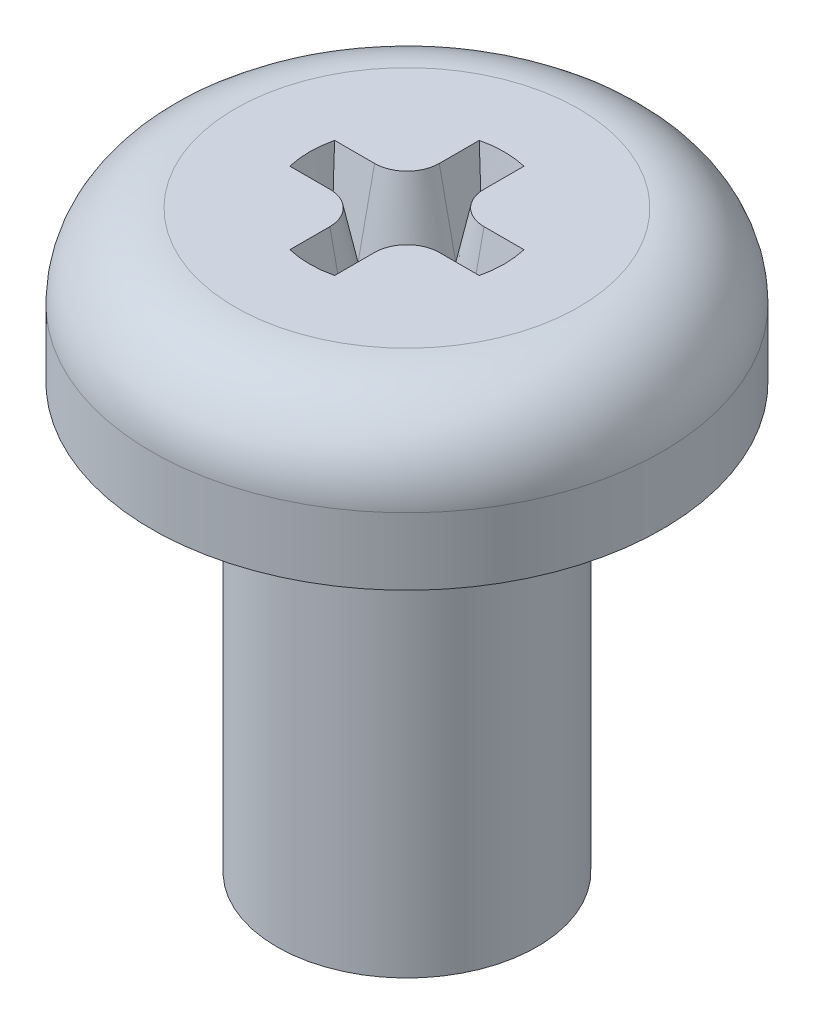
ISO-10303-21;
HEADER;
FILE_DESCRIPTION(('STEP AP214'),'2;1');
FILE_NAME('part.step','',(''),(''),'','','');
FILE_SCHEMA(('AUTOMOTIVE_DESIGN { 1 0 10303 214 1 1 1 1 }'));
ENDSEC;
DATA;
#1=APPLICATION_CONTEXT('core data for automotive mechanical design processes');
#2=APPLICATION_PROTOCOL_DEFINITION('international standard','automotive_design',2000,#1);
#3=PRODUCT_CONTEXT('',#1,'mechanical');
#4=PRODUCT('Part','Part','',(#3));
#5=PRODUCT_RELATED_PRODUCT_CATEGORY('part','',(#4));
#6=PRODUCT_DEFINITION_FORMATION('','',#4);
#7=PRODUCT_DEFINITION_CONTEXT('part definition',#1,'design');
#8=PRODUCT_DEFINITION('design','',#6,#7);
#9=PRODUCT_DEFINITION_SHAPE('','',#8);
#10=(LENGTH_UNIT() NAMED_UNIT(*) SI_UNIT(.MILLI.,.METRE.));
#11=(NAMED_UNIT(*) PLANE_ANGLE_UNIT() SI_UNIT($,.RADIAN.));
#12=(NAMED_UNIT(*) SI_UNIT($,.STERADIAN.) SOLID_ANGLE_UNIT());
#13=UNCERTAINTY_MEASURE_WITH_UNIT(LENGTH_MEASURE(1.E-05),#10,'distance_accuracy_value','');
#14=(GEOMETRIC_REPRESENTATION_CONTEXT(3) GLOBAL_UNCERTAINTY_ASSIGNED_CONTEXT((#13)) GLOBAL_UNIT_ASSIGNED_CONTEXT((#10,
#11,#12)) REPRESENTATION_CONTEXT('',''));
#15=CARTESIAN_POINT('',(0.,0.,0.));
#16=DIRECTION('',(0.,0.,1.));
#17=DIRECTION('',(1.,0.,0.));
#18=AXIS2_PLACEMENT_3D('',#15,#16,#17);
#19=CARTESIAN_POINT('',(47.9816722439769,38.2948169415952,31.7864000000001));
#20=DIRECTION('',(0.,1.,0.));
#21=DIRECTION('',(-1.,0.,0.));
#22=AXIS2_PLACEMENT_3D('',#19,#20,#21);
#23=CONICAL_SURFACE('',#22,1.80500000000027,0.209439510232852);
#24=CARTESIAN_POINT('',(47.9816722439768,36.5168169415951,31.7864000000001));
#25=DIRECTION('',(0.,-1.,0.));
#26=DIRECTION('',(0.,0.,-1.));
#27=AXIS2_PLACEMENT_3D('',#24,#25,#26);
#28=CIRCLE('',#27,1.42707443336297);
#29=CARTESIAN_POINT('',(46.5550794763136,36.5168169415951,31.7493255666379));
#30=VERTEX_POINT('',#29);
#31=CARTESIAN_POINT('',(46.5550794763137,36.5168169415946,31.8234744333615));
#32=VERTEX_POINT('',#31);
#33=EDGE_CURVE('E156',#30,#32,#28,.F.);
#34=ORIENTED_EDGE('',*,*,#33,.F.);
#35=CARTESIAN_POINT('',(46.5550794763137,36.516816941595,31.749325566638));
#36=CARTESIAN_POINT('',(46.5245215918113,36.6644287714075,31.7179497036321));
#37=CARTESIAN_POINT('',(46.4948821882316,36.8122195798969,31.6865357975341));
#38=CARTESIAN_POINT('',(46.4372001783261,37.1080867544644,31.6236472881989));
#39=CARTESIAN_POINT('',(46.4091574395983,37.2561630958091,31.592172690219));
#40=CARTESIAN_POINT('',(46.3544243003777,37.5525496806388,31.5291737768244));
#41=CARTESIAN_POINT('',(46.3277338652946,37.7008599180411,31.4976494627026));
#42=CARTESIAN_POINT('',(46.2755352299222,37.9976921839881,31.4345558168621));
#43=CARTESIAN_POINT('',(46.2500271277517,38.1462142290598,31.4029864816304));
#44=CARTESIAN_POINT('',(46.2250277153369,38.2948169415951,31.3714));
#45=B_SPLINE_CURVE_WITH_KNOTS('',3,(#35,#36,#37,#38,#39,#40,#41,#42,#43,#44),.UNSPECIFIED.,.F.,
.F.,(4,2,2,2,4),(0.,0.46190993046533,0.923781501494103,1.38564125239672,1.84753926344676),.UNSPECIFIED.);
#46=CARTESIAN_POINT('',(46.2250277153369,38.2948169415951,31.3714));
#47=VERTEX_POINT('',#46);
#48=EDGE_CURVE('E163',#30,#47,#45,.T.);
#49=ORIENTED_EDGE('',*,*,#48,.T.);
#50=CARTESIAN_POINT('',(47.9816722439769,38.2948169415952,31.7864000000001));
#51=DIRECTION('',(0.,1.,0.));
#52=DIRECTION('',(-1.,0.,0.));
#53=AXIS2_PLACEMENT_3D('',#50,#51,#52);
#54=CIRCLE('',#53,1.80500000000027);
#55=CARTESIAN_POINT('',(46.2250277153368,38.2948169415951,32.2014));
#56=VERTEX_POINT('',#55);
#57=EDGE_CURVE('E38',#56,#47,#54,.F.);
#58=ORIENTED_EDGE('',*,*,#57,.F.);
#59=CARTESIAN_POINT('',(46.2250277153368,38.2948169415951,32.2014));
#60=CARTESIAN_POINT('',(46.2500271277516,38.1462142290597,32.1698135183696));
#61=CARTESIAN_POINT('',(46.2755352299221,37.997692183988,32.1382441831378));
#62=CARTESIAN_POINT('',(46.3277338652945,37.7008599180408,32.0751505372972));
#63=CARTESIAN_POINT('',(46.3544243003777,37.5525496806385,32.0436262231754));
#64=CARTESIAN_POINT('',(46.4091574395983,37.2561630958086,31.9806273097807));
#65=CARTESIAN_POINT('',(46.4372001783262,37.1080867544639,31.9491527118007));
#66=CARTESIAN_POINT('',(46.4948821882317,36.8122195798963,31.8862642024653));
#67=CARTESIAN_POINT('',(46.5245215918114,36.6644287714068,31.8548502963673));
#68=CARTESIAN_POINT('',(46.5550794763139,36.5168169415942,31.8234744333614));
#69=B_SPLINE_CURVE_WITH_KNOTS('',3,(#59,#60,#61,#62,#63,#64,#65,#66,#67,#68),.UNSPECIFIED.,.F.,
.F.,(4,2,2,2,4),(0.,0.461898011050259,0.923757761953113,1.38562933298211,1.84753926344766),.UNSPECIFIED.);
#70=EDGE_CURVE('E155',#56,#32,#69,.T.);
#71=ORIENTED_EDGE('',*,*,#70,.T.);
#72=EDGE_LOOP('',(#34,#49,#58,#71));
#73=FACE_BOUND('',#72,.T.);
#74=ADVANCED_FACE('F34',(#73),#23,.F.);
#75=CARTESIAN_POINT('',(47.0768366968424,38.5078302552215,32.2466773775324));
#76=DIRECTION('',(7.26722801982392E-13,-0.207911690811912,0.978147600735049));
#77=DIRECTION('',(-1.,0.,7.42958221679716E-13));
#78=AXIS2_PLACEMENT_3D('',#75,#76,#77);
#79=PLANE('',#78);
#80=DIRECTION('',(1.,0.,-7.42958221679737E-13));
#81=VECTOR('',#80,1.);
#82=CARTESIAN_POINT('',(46.5958499796573,36.5168169415938,31.8234744333613));
#83=LINE('',#82,#81);
#84=CARTESIAN_POINT('',(46.966672243978,36.5168169415944,31.8234744333611));
#85=VERTEX_POINT('',#84);
#86=EDGE_CURVE('E166',#32,#85,#83,.T.);
#87=ORIENTED_EDGE('',*,*,#86,.F.);
#88=ORIENTED_EDGE('',*,*,#70,.F.);
#89=DIRECTION('',(-1.,0.,7.42958221679716E-13));
#90=VECTOR('',#89,1.);
#91=CARTESIAN_POINT('',(46.5958499796575,38.2948169415951,32.2013999999997));
#92=LINE('',#91,#90);
#93=CARTESIAN_POINT('',(46.9666722439783,38.2948169415951,32.2013999999995));
#94=VERTEX_POINT('',#93);
#95=EDGE_CURVE('E144',#94,#56,#92,.T.);
#96=ORIENTED_EDGE('',*,*,#95,.F.);
#97=DIRECTION('',(-1.52694317747175E-13,-0.97814760073505,-0.207911690811907));
#98=VECTOR('',#97,1.);
#99=CARTESIAN_POINT('',(46.9666722439781,37.4058169415951,32.0124372166804));
#100=LINE('',#99,#98);
#101=EDGE_CURVE('E323',#94,#85,#100,.T.);
#102=ORIENTED_EDGE('',*,*,#101,.T.);
#103=EDGE_LOOP('',(#87,#88,#96,#102));
#104=FACE_BOUND('',#103,.T.);
#105=ADVANCED_FACE('F165',(#104),#79,.F.);
#106=CARTESIAN_POINT('',(46.1148632624727,38.5078302552215,31.326122622467));
#107=DIRECTION('',(-7.19667240798664E-13,-0.207911690811906,-0.97814760073505));
#108=DIRECTION('',(1.,0.,-7.35745035062045E-13));
#109=AXIS2_PLACEMENT_3D('',#106,#107,#108);
#110=PLANE('',#109);
#111=DIRECTION('',(-1.,0.,7.42958221680305E-13));
#112=VECTOR('',#111,1.);
#113=CARTESIAN_POINT('',(46.5958499796575,36.5168169415951,31.7493255666379));
#114=LINE('',#113,#112);
#115=CARTESIAN_POINT('',(46.966672243978,36.5168169415951,31.7493255666376));
#116=VERTEX_POINT('',#115);
#117=EDGE_CURVE('E324',#116,#30,#114,.T.);
#118=ORIENTED_EDGE('',*,*,#117,.F.);
#119=DIRECTION('',(-1.56511675690854E-13,0.97814760073505,-0.207911690811907));
#120=VECTOR('',#119,1.);
#121=CARTESIAN_POINT('',(46.9666722439778,37.4058169415951,31.5603627833185));
#122=LINE('',#121,#120);
#123=CARTESIAN_POINT('',(46.9666722439776,38.2948169415951,31.3713999999995));
#124=VERTEX_POINT('',#123);
#125=EDGE_CURVE('E319',#116,#124,#122,.T.);
#126=ORIENTED_EDGE('',*,*,#125,.T.);
#127=DIRECTION('',(1.,0.,-7.35745035062039E-13));
#128=VECTOR('',#127,1.);
#129=CARTESIAN_POINT('',(46.5958499796572,38.2948169415951,31.3713999999997));
#130=LINE('',#129,#128);
#131=EDGE_CURVE('E168',#47,#124,#130,.T.);
#132=ORIENTED_EDGE('',*,*,#131,.F.);
#133=ORIENTED_EDGE('',*,*,#48,.F.);
#134=EDGE_LOOP('',(#118,#126,#132,#133));
#135=FACE_BOUND('',#134,.T.);
#136=ADVANCED_FACE('F188',(#135),#110,.F.);
#137=CARTESIAN_POINT('',(46.9666722439787,38.2948169415951,32.8013999999995));
#138=DIRECTION('',(0.,-1.,0.));
#139=DIRECTION('',(0.,0.,-1.));
#140=AXIS2_PLACEMENT_3D('',#137,#138,#139);
#141=CONICAL_SURFACE('',#140,0.599999999999983,0.209439510233353);
#142=CARTESIAN_POINT('',(46.9666722439787,36.5168169415951,32.8013999999995));
#143=DIRECTION('',(0.,-1.,0.));
#144=DIRECTION('',(0.,0.,-1.));
#145=AXIS2_PLACEMENT_3D('',#142,#143,#144);
#146=CIRCLE('',#145,0.977925566638193);
#147=CARTESIAN_POINT('',(47.9445978106169,36.5168169415951,32.8013999999987));
#148=VERTEX_POINT('',#147);
#149=EDGE_CURVE('E322',#85,#148,#146,.T.);
#150=ORIENTED_EDGE('',*,*,#149,.F.);
#151=ORIENTED_EDGE('',*,*,#101,.F.);
#152=CARTESIAN_POINT('',(46.9666722439787,38.2948169415951,32.8013999999995));
#153=DIRECTION('',(0.,-1.,0.));
#154=DIRECTION('',(0.,0.,-1.));
#155=AXIS2_PLACEMENT_3D('',#152,#153,#154);
#156=CIRCLE('',#155,0.599999999999984);
#157=CARTESIAN_POINT('',(47.5666722439787,38.2948169415951,32.801399999999));
#158=VERTEX_POINT('',#157);
#159=EDGE_CURVE('E150',#158,#94,#156,.F.);
#160=ORIENTED_EDGE('',*,*,#159,.F.);
#161=DIRECTION('',(0.207911690811906,-0.97814760073505,-1.57053630540026E-13));
#162=VECTOR('',#161,1.);
#163=CARTESIAN_POINT('',(47.7556350272978,37.4058169415951,32.8013999999989));
#164=LINE('',#163,#162);
#165=EDGE_CURVE('E333',#158,#148,#164,.T.);
#166=ORIENTED_EDGE('',*,*,#165,.T.);
#167=EDGE_LOOP('',(#150,#151,#160,#166));
#168=FACE_BOUND('',#167,.T.);
#169=ADVANCED_FACE('F420',(#168),#141,.T.);
#170=CARTESIAN_POINT('',(46.9666722439772,38.2948169415951,30.7713999999994));
#171=DIRECTION('',(0.,-1.,0.));
#172=DIRECTION('',(1.,0.,0.));
#173=AXIS2_PLACEMENT_3D('',#170,#171,#172);
#174=CONICAL_SURFACE('',#173,0.600000000000014,0.20943951023329);
#175=CARTESIAN_POINT('',(46.9666722439773,36.516816941595,30.7713999999995));
#176=DIRECTION('',(0.,-1.,0.));
#177=DIRECTION('',(1.,0.,0.));
#178=AXIS2_PLACEMENT_3D('',#175,#176,#177);
#179=CIRCLE('',#178,0.977925566638112);
#180=CARTESIAN_POINT('',(47.9445978106155,36.5168169415944,30.7713999999987));
#181=VERTEX_POINT('',#180);
#182=EDGE_CURVE('E317',#181,#116,#179,.T.);
#183=ORIENTED_EDGE('',*,*,#182,.F.);
#184=DIRECTION('',(-0.2079116908119,0.978147600735051,1.47815181684731E-13));
#185=VECTOR('',#184,1.);
#186=CARTESIAN_POINT('',(47.7556350272963,37.4058169415951,30.7713999999989));
#187=LINE('',#186,#185);
#188=CARTESIAN_POINT('',(47.5666722439772,38.2948169415951,30.771399999999));
#189=VERTEX_POINT('',#188);
#190=EDGE_CURVE('E316',#181,#189,#187,.T.);
#191=ORIENTED_EDGE('',*,*,#190,.T.);
#192=CARTESIAN_POINT('',(46.9666722439772,38.2948169415951,30.7713999999994));
#193=DIRECTION('',(0.,-1.,0.));
#194=DIRECTION('',(1.,0.,0.));
#195=AXIS2_PLACEMENT_3D('',#192,#193,#194);
#196=CIRCLE('',#195,0.600000000000012);
#197=EDGE_CURVE('E320',#124,#189,#196,.F.);
#198=ORIENTED_EDGE('',*,*,#197,.F.);
#199=ORIENTED_EDGE('',*,*,#125,.F.);
#200=EDGE_LOOP('',(#183,#191,#198,#199));
#201=FACE_BOUND('',#200,.T.);
#202=ADVANCED_FACE('F303',(#201),#174,.T.);
#203=CARTESIAN_POINT('',(47.5213948664463,38.5078302552215,33.6532089815046));
#204=DIRECTION('',(-0.978147600735049,-0.207911690811909,7.33778363166704E-13));
#205=DIRECTION('',(-7.50171408297982E-13,0.,-1.));
#206=AXIS2_PLACEMENT_3D('',#203,#204,#205);
#207=PLANE('',#206);
#208=DIRECTION('',(7.57384594916231E-13,0.,1.));
#209=VECTOR('',#208,1.);
#210=CARTESIAN_POINT('',(47.9445978106171,36.5168169415951,33.1722222643194));
#211=LINE('',#210,#209);
#212=CARTESIAN_POINT('',(47.9445978106172,36.5168169415952,33.2129927676611));
#213=VERTEX_POINT('',#212);
#214=EDGE_CURVE('E330',#148,#213,#211,.T.);
#215=ORIENTED_EDGE('',*,*,#214,.F.);
#216=ORIENTED_EDGE('',*,*,#165,.F.);
#217=DIRECTION('',(-7.57384594916231E-13,0.,-1.));
#218=VECTOR('',#217,1.);
#219=CARTESIAN_POINT('',(47.566672243979,38.2948169415951,33.1722222643197));
#220=LINE('',#219,#218);
#221=CARTESIAN_POINT('',(47.5666722439792,38.2948169415951,33.5430445286404));
#222=VERTEX_POINT('',#221);
#223=EDGE_CURVE('E334',#222,#158,#220,.T.);
#224=ORIENTED_EDGE('',*,*,#223,.F.);
#225=CARTESIAN_POINT('',(47.5666722439792,38.2948169415951,33.5430445286404));
#226=CARTESIAN_POINT('',(47.5982587256096,38.1462142290598,33.5180451162254));
#227=CARTESIAN_POINT('',(47.6298280608413,37.9976921839881,33.4925370140547));
#228=CARTESIAN_POINT('',(47.6929217066818,37.7008599180411,33.4403383786819));
#229=CARTESIAN_POINT('',(47.7244460208036,37.5525496806389,33.4136479435985));
#230=CARTESIAN_POINT('',(47.7874449341982,37.2561630958092,33.3589148043775));
#231=CARTESIAN_POINT('',(47.8189195321781,37.1080867544646,33.3308720656495));
#232=CARTESIAN_POINT('',(47.8818080415133,36.8122195798971,33.2731900557436));
#233=CARTESIAN_POINT('',(47.9132219476113,36.6644287714077,33.2435506521637));
#234=CARTESIAN_POINT('',(47.9445978106171,36.5168169415952,33.2129927676611));
#235=B_SPLINE_CURVE_WITH_KNOTS('',3,(#225,#226,#227,#228,#229,#230,#231,#232,#233,#234),
.UNSPECIFIED.,.F.,.F.,(4,2,2,2,4),(0.,0.461898011050083,0.923757761952754,1.38562933298158,
1.84753926344695),.UNSPECIFIED.);
#236=EDGE_CURVE('E307',#222,#213,#235,.T.);
#237=ORIENTED_EDGE('',*,*,#236,.T.);
#238=EDGE_LOOP('',(#215,#216,#224,#237));
#239=FACE_BOUND('',#238,.T.);
#240=ADVANCED_FACE('F298',(#239),#207,.F.);
#241=CARTESIAN_POINT('',(47.5213948664442,38.5078302552215,30.8815644528629));
#242=DIRECTION('',(-0.978147600735051,-0.2079116908119,7.26722801984832E-13));
#243=DIRECTION('',(-7.42958221682208E-13,0.,-1.));
#244=AXIS2_PLACEMENT_3D('',#241,#242,#243);
#245=PLANE('',#244);
#246=DIRECTION('',(7.35745035063934E-13,0.,1.));
#247=VECTOR('',#246,1.);
#248=CARTESIAN_POINT('',(47.9445978106153,36.5168169415938,30.4005777356794));
#249=LINE('',#248,#247);
#250=CARTESIAN_POINT('',(47.9445978106153,36.5168169415956,30.3598072323492));
#251=VERTEX_POINT('',#250);
#252=EDGE_CURVE('E336',#251,#181,#249,.T.);
#253=ORIENTED_EDGE('',*,*,#252,.F.);
#254=CARTESIAN_POINT('',(47.9445978106149,36.5168169415956,30.3598072323492));
#255=CARTESIAN_POINT('',(47.9132219476091,36.6644287714081,30.3292493478458));
#256=CARTESIAN_POINT('',(47.8818080415111,36.8122195798974,30.2996099442651));
#257=CARTESIAN_POINT('',(47.8189195321758,37.1080867544648,30.2419279343576));
#258=CARTESIAN_POINT('',(47.7874449341958,37.2561630958094,30.2138851956288));
#259=CARTESIAN_POINT('',(47.7244460208011,37.5525496806391,30.1591520564062));
#260=CARTESIAN_POINT('',(47.6929217066793,37.7008599180412,30.1324616213221));
#261=CARTESIAN_POINT('',(47.6298280608388,37.9976921839882,30.0802629859477));
#262=CARTESIAN_POINT('',(47.5982587256071,38.1462142290598,30.0547548837761));
#263=CARTESIAN_POINT('',(47.5666722439766,38.2948169415951,30.0297554713603));
#264=B_SPLINE_CURVE_WITH_KNOTS('',3,(#254,#255,#256,#257,#258,#259,#260,#261,#262,#263),
.UNSPECIFIED.,.F.,.F.,(4,2,2,2,4),(0.,0.461909930465738,0.923781501494914,1.38564125239794,
1.84753926344838),.UNSPECIFIED.);
#265=CARTESIAN_POINT('',(47.5666722439766,38.2948169415951,30.0297554713603));
#266=VERTEX_POINT('',#265);
#267=EDGE_CURVE('E280',#251,#266,#264,.T.);
#268=ORIENTED_EDGE('',*,*,#267,.T.);
#269=DIRECTION('',(-7.42958221682205E-13,0.,-1.));
#270=VECTOR('',#269,1.);
#271=CARTESIAN_POINT('',(47.5666722439769,38.2948169415951,30.4005777356796));
#272=LINE('',#271,#270);
#273=EDGE_CURVE('E332',#189,#266,#272,.T.);
#274=ORIENTED_EDGE('',*,*,#273,.F.);
#275=ORIENTED_EDGE('',*,*,#190,.F.);
#276=EDGE_LOOP('',(#253,#268,#274,#275));
#277=FACE_BOUND('',#276,.T.);
#278=ADVANCED_FACE('F294',(#277),#245,.F.);
#279=CARTESIAN_POINT('',(47.9816722439766,38.2948169415951,31.7864000000001));
#280=DIRECTION('',(0.,1.,0.));
#281=DIRECTION('',(0.,0.,1.));
#282=AXIS2_PLACEMENT_3D('',#279,#280,#281);
#283=CONICAL_SURFACE('',#282,1.80499999999991,0.209439510233975);
#284=CARTESIAN_POINT('',(47.9816722439766,36.5168169415951,31.7864000000001));
#285=DIRECTION('',(0.,-1.,0.));
#286=DIRECTION('',(0.,0.,-1.));
#287=AXIS2_PLACEMENT_3D('',#284,#285,#286);
#288=CIRCLE('',#287,1.42707443336054);
#289=CARTESIAN_POINT('',(48.0187466773406,36.5168169415949,33.2129927676609));
#290=VERTEX_POINT('',#289);
#291=EDGE_CURVE('E313',#213,#290,#288,.F.);
#292=ORIENTED_EDGE('',*,*,#291,.F.);
#293=ORIENTED_EDGE('',*,*,#236,.F.);
#294=CARTESIAN_POINT('',(47.9816722439766,38.2948169415951,31.7864000000001));
#295=DIRECTION('',(0.,1.,0.));
#296=DIRECTION('',(0.,0.,1.));
#297=AXIS2_PLACEMENT_3D('',#294,#295,#296);
#298=CIRCLE('',#297,1.80499999999991);
#299=CARTESIAN_POINT('',(48.3966722439792,38.2948169415951,33.5430445286392));
#300=VERTEX_POINT('',#299);
#301=EDGE_CURVE('E314',#300,#222,#298,.F.);
#302=ORIENTED_EDGE('',*,*,#301,.F.);
#303=CARTESIAN_POINT('',(48.3966722439792,38.294816941595,33.5430445286392));
#304=CARTESIAN_POINT('',(48.3650857623488,38.1462142290597,33.5180451162243));
#305=CARTESIAN_POINT('',(48.333516427117,37.997692183988,33.4925370140536));
#306=CARTESIAN_POINT('',(48.2704227812764,37.7008599180409,33.440338378681));
#307=CARTESIAN_POINT('',(48.2388984671547,37.5525496806387,33.4136479435977));
#308=CARTESIAN_POINT('',(48.1758995537599,37.2561630958089,33.3589148043769));
#309=CARTESIAN_POINT('',(48.1444249557799,37.1080867544642,33.3308720656489));
#310=CARTESIAN_POINT('',(48.0815364464446,36.8122195798967,33.2731900557432));
#311=CARTESIAN_POINT('',(48.0501225403466,36.6644287714073,33.2435506521634));
#312=CARTESIAN_POINT('',(48.0187466773407,36.5168169415948,33.2129927676609));
#313=B_SPLINE_CURVE_WITH_KNOTS('',3,(#303,#304,#305,#306,#307,#308,#309,#310,#311,#312),
.UNSPECIFIED.,.F.,.F.,(4,2,2,2,4),(0.,0.461898011050155,0.923757761952905,1.38562933298181,
1.84753926344725),.UNSPECIFIED.);
#314=EDGE_CURVE('E289',#300,#290,#313,.T.);
#315=ORIENTED_EDGE('',*,*,#314,.T.);
#316=EDGE_LOOP('',(#292,#293,#302,#315));
#317=FACE_BOUND('',#316,.T.);
#318=ADVANCED_FACE('F273',(#317),#283,.F.);
#319=CARTESIAN_POINT('',(47.9816722439766,38.2948169415951,31.7864));
#320=DIRECTION('',(0.,1.,0.));
#321=DIRECTION('',(0.,0.,1.));
#322=AXIS2_PLACEMENT_3D('',#319,#320,#321);
#323=CONICAL_SURFACE('',#322,1.80499999999994,0.209439510239465);
#324=CARTESIAN_POINT('',(47.9816722439766,36.5168169415974,31.7864));
#325=DIRECTION('',(0.,1.,0.));
#326=DIRECTION('',(0.,0.,1.));
#327=AXIS2_PLACEMENT_3D('',#324,#325,#326);
#328=CIRCLE('',#327,1.42707443335087);
#329=CARTESIAN_POINT('',(48.0187466773389,36.5168169415963,30.3598072323491));
#330=VERTEX_POINT('',#329);
#331=EDGE_CURVE('E342',#251,#330,#328,.F.);
#332=ORIENTED_EDGE('',*,*,#331,.T.);
#333=CARTESIAN_POINT('',(48.0187466773391,36.5168169415968,30.359807232349));
#334=CARTESIAN_POINT('',(48.0501225403448,36.6644287714092,30.3292493478456));
#335=CARTESIAN_POINT('',(48.0815364464428,36.8122195798985,30.2996099442649));
#336=CARTESIAN_POINT('',(48.1444249557779,37.1080867544656,30.2419279343575));
#337=CARTESIAN_POINT('',(48.1758995537579,37.2561630958101,30.2138851956287));
#338=CARTESIAN_POINT('',(48.2388984671524,37.5525496806396,30.1591520564062));
#339=CARTESIAN_POINT('',(48.2704227812741,37.7008599180416,30.132461621322));
#340=CARTESIAN_POINT('',(48.3335164271146,37.9976921839884,30.0802629859476));
#341=CARTESIAN_POINT('',(48.3650857623463,38.1462142290599,30.0547548837761));
#342=CARTESIAN_POINT('',(48.3966722439766,38.2948169415951,30.0297554713603));
#343=B_SPLINE_CURVE_WITH_KNOTS('',3,(#333,#334,#335,#336,#337,#338,#339,#340,#341,#342),
.UNSPECIFIED.,.F.,.F.,(4,2,2,2,4),(0.,0.461909930465392,0.923781501494224,1.3856412523969,
1.84753926344701),.UNSPECIFIED.);
#344=CARTESIAN_POINT('',(48.3966722439766,38.2948169415951,30.0297554713603));
#345=VERTEX_POINT('',#344);
#346=EDGE_CURVE('E255',#330,#345,#343,.T.);
#347=ORIENTED_EDGE('',*,*,#346,.T.);
#348=CARTESIAN_POINT('',(47.9816722439766,38.2948169415951,31.7864));
#349=DIRECTION('',(0.,1.,0.));
#350=DIRECTION('',(0.,0.,1.));
#351=AXIS2_PLACEMENT_3D('',#348,#349,#350);
#352=CIRCLE('',#351,1.80499999999994);
#353=EDGE_CURVE('E288',#266,#345,#352,.F.);
#354=ORIENTED_EDGE('',*,*,#353,.F.);
#355=ORIENTED_EDGE('',*,*,#267,.F.);
#356=EDGE_LOOP('',(#332,#347,#354,#355));
#357=FACE_BOUND('',#356,.T.);
#358=ADVANCED_FACE('F268',(#357),#323,.F.);
#359=CARTESIAN_POINT('',(48.4419496215117,38.5078302552215,32.6912355471343));
#360=DIRECTION('',(0.978147600735049,-0.207911690811912,-6.98500557245766E-13));
#361=DIRECTION('',(7.14105475207284E-13,0.,1.));
#362=AXIS2_PLACEMENT_3D('',#359,#360,#361);
#363=PLANE('',#362);
#364=DIRECTION('',(0.,0.,1.));
#365=VECTOR('',#364,1.);
#366=CARTESIAN_POINT('',(48.0187466773405,36.5168169415951,31.7863995343388));
#367=LINE('',#366,#365);
#368=CARTESIAN_POINT('',(48.0187466773405,36.5168169415951,32.8013999999983));
#369=VERTEX_POINT('',#368);
#370=EDGE_CURVE('E343',#369,#290,#367,.T.);
#371=ORIENTED_EDGE('',*,*,#370,.T.);
#372=ORIENTED_EDGE('',*,*,#314,.F.);
#373=DIRECTION('',(7.21318661825539E-13,0.,1.));
#374=VECTOR('',#373,1.);
#375=CARTESIAN_POINT('',(48.396672243979,38.2948169415951,33.1722222643188));
#376=LINE('',#375,#374);
#377=CARTESIAN_POINT('',(48.3966722439787,38.2948169415951,32.8013999999984));
#378=VERTEX_POINT('',#377);
#379=EDGE_CURVE('E287',#378,#300,#376,.T.);
#380=ORIENTED_EDGE('',*,*,#379,.F.);
#381=DIRECTION('',(-0.207911690811911,-0.978147600735049,1.52694317747174E-13));
#382=VECTOR('',#381,1.);
#383=CARTESIAN_POINT('',(48.2077094606596,37.4058169415951,32.8013999999986));
#384=LINE('',#383,#382);
#385=EDGE_CURVE('E367',#378,#369,#384,.T.);
#386=ORIENTED_EDGE('',*,*,#385,.T.);
#387=EDGE_LOOP('',(#371,#372,#380,#386));
#388=FACE_BOUND('',#387,.T.);
#389=ADVANCED_FACE('F272',(#388),#363,.F.);
#390=CARTESIAN_POINT('',(45.892159709537,36.5168169415951,29.6968865342379));
#391=DIRECTION('',(0.,-1.,0.));
#392=DIRECTION('',(1.,0.,0.));
#393=AXIS2_PLACEMENT_3D('',#390,#391,#392);
#394=PLANE('',#393);
#395=DIRECTION('',(1.,0.,0.));
#396=VECTOR('',#395,1.);
#397=CARTESIAN_POINT('',(47.9816727096379,36.5168169415951,31.7493255666361));
#398=LINE('',#397,#396);
#399=CARTESIAN_POINT('',(48.9966722439775,36.5168169415951,31.7493255666361));
#400=VERTEX_POINT('',#399);
#401=CARTESIAN_POINT('',(49.4082650116414,36.5168169415946,31.7493255666361));
#402=VERTEX_POINT('',#401);
#403=EDGE_CURVE('E340',#400,#402,#398,.T.);
#404=ORIENTED_EDGE('',*,*,#403,.F.);
#405=CARTESIAN_POINT('',(48.9966722439772,36.5168169415951,30.7713999999979));
#406=DIRECTION('',(0.,-1.,0.));
#407=DIRECTION('',(0.,0.,-1.));
#408=AXIS2_PLACEMENT_3D('',#405,#406,#407);
#409=CIRCLE('',#408,0.977925566638165);
#410=CARTESIAN_POINT('',(48.018746677339,36.5168169415951,30.7713999999987));
#411=VERTEX_POINT('',#410);
#412=EDGE_CURVE('E366',#400,#411,#409,.T.);
#413=ORIENTED_EDGE('',*,*,#412,.T.);
#414=DIRECTION('',(-7.429582216828E-13,0.,-1.));
#415=VECTOR('',#414,1.);
#416=CARTESIAN_POINT('',(48.0187466773387,36.5168169415951,30.4005777356796));
#417=LINE('',#416,#415);
#418=EDGE_CURVE('E264',#411,#330,#417,.T.);
#419=ORIENTED_EDGE('',*,*,#418,.T.);
#420=ORIENTED_EDGE('',*,*,#331,.F.);
#421=ORIENTED_EDGE('',*,*,#252,.T.);
#422=ORIENTED_EDGE('',*,*,#182,.T.);
#423=ORIENTED_EDGE('',*,*,#117,.T.);
#424=ORIENTED_EDGE('',*,*,#33,.T.);
#425=ORIENTED_EDGE('',*,*,#86,.T.);
#426=ORIENTED_EDGE('',*,*,#149,.T.);
#427=ORIENTED_EDGE('',*,*,#214,.T.);
#428=ORIENTED_EDGE('',*,*,#291,.T.);
#429=ORIENTED_EDGE('',*,*,#370,.F.);
#430=CARTESIAN_POINT('',(48.9966722439787,36.5168169415951,32.801399999998));
#431=DIRECTION('',(0.,-1.,0.));
#432=DIRECTION('',(0.,0.,-1.));
#433=AXIS2_PLACEMENT_3D('',#430,#431,#432);
#434=CIRCLE('',#433,0.977925566638171);
#435=CARTESIAN_POINT('',(48.9966722439783,36.5168169415951,31.8234744333594));
#436=VERTEX_POINT('',#435);
#437=EDGE_CURVE('E369',#369,#436,#434,.T.);
#438=ORIENTED_EDGE('',*,*,#437,.T.);
#439=DIRECTION('',(-1.,0.,0.));
#440=VECTOR('',#439,1.);
#441=CARTESIAN_POINT('',(47.9816727096379,36.5168169415951,31.8234744333589));
#442=LINE('',#441,#440);
#443=CARTESIAN_POINT('',(49.4082650116416,36.516816941595,31.8234744333592));
#444=VERTEX_POINT('',#443);
#445=EDGE_CURVE('E346',#444,#436,#442,.T.);
#446=ORIENTED_EDGE('',*,*,#445,.F.);
#447=CARTESIAN_POINT('',(47.9816722439767,36.5168169415949,31.7864));
#448=DIRECTION('',(-1.17473939470838E-13,1.,0.));
#449=DIRECTION('',(-1.,-1.17473939470838E-13,0.));
#450=AXIS2_PLACEMENT_3D('',#447,#448,#449);
#451=CIRCLE('',#450,1.42707443336454);
#452=EDGE_CURVE('E266',#402,#444,#451,.F.);
#453=ORIENTED_EDGE('',*,*,#452,.F.);
#454=EDGE_LOOP('',(#404,#413,#419,#420,#421,#422,#423,#424,#425,#426,#427,#428,#429,#438,#446,#453));
#455=FACE_BOUND('',#454,.T.);
#456=ADVANCED_FACE('F251',(#455),#394,.F.);
#457=CARTESIAN_POINT('',(48.4419496215096,38.5078302552215,29.9195910184965));
#458=DIRECTION('',(0.978147600735051,-0.207911690811903,-7.19667240801081E-13));
#459=DIRECTION('',(7.35745035064515E-13,0.,1.));
#460=AXIS2_PLACEMENT_3D('',#457,#458,#459);
#461=PLANE('',#460);
#462=ORIENTED_EDGE('',*,*,#418,.F.);
#463=DIRECTION('',(0.207911690811893,0.978147600735053,-1.54602996719015E-13));
#464=VECTOR('',#463,1.);
#465=CARTESIAN_POINT('',(48.2077094606581,37.4058169415951,30.7713999999985));
#466=LINE('',#465,#464);
#467=CARTESIAN_POINT('',(48.3966722439772,38.2948169415951,30.7713999999984));
#468=VERTEX_POINT('',#467);
#469=EDGE_CURVE('E355',#411,#468,#466,.T.);
#470=ORIENTED_EDGE('',*,*,#469,.T.);
#471=DIRECTION('',(7.35745035064517E-13,0.,1.));
#472=VECTOR('',#471,1.);
#473=CARTESIAN_POINT('',(48.3966722439769,38.2948169415951,30.4005777356793));
#474=LINE('',#473,#472);
#475=EDGE_CURVE('E350',#345,#468,#474,.T.);
#476=ORIENTED_EDGE('',*,*,#475,.F.);
#477=ORIENTED_EDGE('',*,*,#346,.F.);
#478=EDGE_LOOP('',(#462,#470,#476,#477));
#479=FACE_BOUND('',#478,.T.);
#480=ADVANCED_FACE('F246',(#479),#461,.F.);
#481=CARTESIAN_POINT('',(48.9966722439787,38.2948169415951,32.801399999998));
#482=DIRECTION('',(0.,-1.,0.));
#483=DIRECTION('',(0.,0.,-1.));
#484=AXIS2_PLACEMENT_3D('',#481,#482,#483);
#485=CONICAL_SURFACE('',#484,0.60000000000001,0.209439510233326);
#486=ORIENTED_EDGE('',*,*,#437,.F.);
#487=ORIENTED_EDGE('',*,*,#385,.F.);
#488=CARTESIAN_POINT('',(48.9966722439787,38.2948169415951,32.801399999998));
#489=DIRECTION('',(0.,-1.,0.));
#490=DIRECTION('',(0.,0.,-1.));
#491=AXIS2_PLACEMENT_3D('',#488,#489,#490);
#492=CIRCLE('',#491,0.60000000000001);
#493=CARTESIAN_POINT('',(48.9966722439783,38.2948169415951,32.201399999998));
#494=VERTEX_POINT('',#493);
#495=EDGE_CURVE('E263',#494,#378,#492,.F.);
#496=ORIENTED_EDGE('',*,*,#495,.F.);
#497=DIRECTION('',(-1.57053630540027E-13,-0.978147600735053,-0.207911690811891));
#498=VECTOR('',#497,1.);
#499=CARTESIAN_POINT('',(48.9966722439781,37.4058169415951,32.0124372166789));
#500=LINE('',#499,#498);
#501=EDGE_CURVE('E354',#494,#436,#500,.T.);
#502=ORIENTED_EDGE('',*,*,#501,.T.);
#503=EDGE_LOOP('',(#486,#487,#496,#502));
#504=FACE_BOUND('',#503,.T.);
#505=ADVANCED_FACE('F242',(#504),#485,.T.);
#506=CARTESIAN_POINT('',(48.9966722439772,38.2948169415951,30.7713999999979));
#507=DIRECTION('',(0.,-1.,0.));
#508=DIRECTION('',(0.,0.,-1.));
#509=AXIS2_PLACEMENT_3D('',#506,#507,#508);
#510=CONICAL_SURFACE('',#509,0.60000000000001,0.209439510233322);
#511=ORIENTED_EDGE('',*,*,#412,.F.);
#512=DIRECTION('',(-1.4781518168473E-13,0.978147600735049,-0.207911690811908));
#513=VECTOR('',#512,1.);
#514=CARTESIAN_POINT('',(48.9966722439778,37.4058169415951,31.560362783317));
#515=LINE('',#514,#513);
#516=CARTESIAN_POINT('',(48.9966722439776,38.2948169415951,31.371399999998));
#517=VERTEX_POINT('',#516);
#518=EDGE_CURVE('E357',#400,#517,#515,.T.);
#519=ORIENTED_EDGE('',*,*,#518,.T.);
#520=CARTESIAN_POINT('',(48.9966722439772,38.2948169415951,30.7713999999979));
#521=DIRECTION('',(0.,-1.,0.));
#522=DIRECTION('',(0.,0.,-1.));
#523=AXIS2_PLACEMENT_3D('',#520,#521,#522);
#524=CIRCLE('',#523,0.60000000000001);
#525=EDGE_CURVE('E403',#468,#517,#524,.F.);
#526=ORIENTED_EDGE('',*,*,#525,.F.);
#527=ORIENTED_EDGE('',*,*,#469,.F.);
#528=EDGE_LOOP('',(#511,#519,#526,#527));
#529=FACE_BOUND('',#528,.T.);
#530=ADVANCED_FACE('F238',(#529),#510,.T.);
#531=CARTESIAN_POINT('',(49.8484812254809,38.5078302552215,32.2466773775304));
#532=DIRECTION('',(7.26722801984832E-13,-0.2079116908119,0.978147600735051));
#533=DIRECTION('',(-1.,0.,7.42958221682208E-13));
#534=AXIS2_PLACEMENT_3D('',#531,#532,#533);
#535=PLANE('',#534);
#536=ORIENTED_EDGE('',*,*,#445,.T.);
#537=ORIENTED_EDGE('',*,*,#501,.F.);
#538=DIRECTION('',(-1.,0.,7.42958221682202E-13));
#539=VECTOR('',#538,1.);
#540=CARTESIAN_POINT('',(49.3674945082976,38.2948169415951,32.2013999999977));
#541=LINE('',#540,#539);
#542=CARTESIAN_POINT('',(49.738316772617,38.294816941595,32.2013999999974));
#543=VERTEX_POINT('',#542);
#544=EDGE_CURVE('E352',#543,#494,#541,.T.);
#545=ORIENTED_EDGE('',*,*,#544,.F.);
#546=CARTESIAN_POINT('',(49.738316772617,38.2948169415951,32.2013999999974));
#547=CARTESIAN_POINT('',(49.7133173602023,38.1462142290598,32.169813518367));
#548=CARTESIAN_POINT('',(49.6878092580319,37.997692183988,32.1382441831353));
#549=CARTESIAN_POINT('',(49.6356106226598,37.700859918041,32.0751505372948));
#550=CARTESIAN_POINT('',(49.6089201875767,37.5525496806387,32.043626223173));
#551=CARTESIAN_POINT('',(49.5541870483564,37.2561630958089,31.9806273097784));
#552=CARTESIAN_POINT('',(49.5261443096287,37.1080867544642,31.9491527117984));
#553=CARTESIAN_POINT('',(49.4684622997234,36.8122195798967,31.8862642024632));
#554=CARTESIAN_POINT('',(49.4388228961438,36.6644287714072,31.8548502963652));
#555=CARTESIAN_POINT('',(49.4082650116415,36.5168169415947,31.8234744333594));
#556=B_SPLINE_CURVE_WITH_KNOTS('',3,(#546,#547,#548,#549,#550,#551,#552,#553,#554,#555),
.UNSPECIFIED.,.F.,.F.,(4,2,2,2,4),(0.,0.461898011050051,0.923757761952685,1.38562933298147,
1.84753926344682),.UNSPECIFIED.);
#557=EDGE_CURVE('E221',#543,#444,#556,.T.);
#558=ORIENTED_EDGE('',*,*,#557,.T.);
#559=EDGE_LOOP('',(#536,#537,#545,#558));
#560=FACE_BOUND('',#559,.T.);
#561=ADVANCED_FACE('F233',(#560),#535,.F.);
#562=CARTESIAN_POINT('',(48.8865077911138,38.5078302552215,31.326122622465));
#563=DIRECTION('',(-7.26722801985407E-13,-0.207911690811912,-0.978147600735049));
#564=DIRECTION('',(1.,0.,-7.42958221682797E-13));
#565=AXIS2_PLACEMENT_3D('',#562,#563,#564);
#566=PLANE('',#565);
#567=ORIENTED_EDGE('',*,*,#403,.T.);
#568=CARTESIAN_POINT('',(49.4082650116412,36.516816941594,31.7493255666361));
#569=CARTESIAN_POINT('',(49.4388228961435,36.6644287714066,31.7179497036302));
#570=CARTESIAN_POINT('',(49.468462299723,36.8122195798961,31.6865357975321));
#571=CARTESIAN_POINT('',(49.5261443096281,37.1080867544637,31.6236472881968));
#572=CARTESIAN_POINT('',(49.5541870483557,37.2561630958084,31.5921726902168));
#573=CARTESIAN_POINT('',(49.6089201875759,37.5525496806383,31.5291737768221));
#574=CARTESIAN_POINT('',(49.6356106226588,37.7008599180406,31.4976494627003));
#575=CARTESIAN_POINT('',(49.6878092580308,37.9976921839878,31.4345558168596));
#576=CARTESIAN_POINT('',(49.7133173602011,38.1462142290595,31.4029864816279));
#577=CARTESIAN_POINT('',(49.7383167726157,38.2948169415949,31.3713999999974));
#578=B_SPLINE_CURVE_WITH_KNOTS('',3,(#568,#569,#570,#571,#572,#573,#574,#575,#576,#577),
.UNSPECIFIED.,.F.,.F.,(4,2,2,2,4),(0.,0.461909930465441,0.923781501494327,1.38564125239707,
1.84753926344722),.UNSPECIFIED.);
#579=CARTESIAN_POINT('',(49.7383167726157,38.294816941595,31.3713999999974));
#580=VERTEX_POINT('',#579);
#581=EDGE_CURVE('E214',#402,#580,#578,.T.);
#582=ORIENTED_EDGE('',*,*,#581,.T.);
#583=DIRECTION('',(1.,0.,-7.42958221682797E-13));
#584=VECTOR('',#583,1.);
#585=CARTESIAN_POINT('',(49.3674945082967,38.2948169415951,31.3713999999977));
#586=LINE('',#585,#584);
#587=EDGE_CURVE('E53',#517,#580,#586,.T.);
#588=ORIENTED_EDGE('',*,*,#587,.F.);
#589=ORIENTED_EDGE('',*,*,#518,.F.);
#590=EDGE_LOOP('',(#567,#582,#588,#589));
#591=FACE_BOUND('',#590,.T.);
#592=ADVANCED_FACE('F230',(#591),#566,.F.);
#593=CARTESIAN_POINT('',(47.9816722439765,38.2948169415949,31.7864));
#594=DIRECTION('',(-1.17473939470838E-13,1.,0.));
#595=DIRECTION('',(-1.,-1.17473939470838E-13,0.));
#596=AXIS2_PLACEMENT_3D('',#593,#594,#595);
#597=CONICAL_SURFACE('',#596,1.80500000000011,0.209439510231937);
#598=ORIENTED_EDGE('',*,*,#452,.T.);
#599=ORIENTED_EDGE('',*,*,#557,.F.);
#600=CARTESIAN_POINT('',(47.9816722439765,38.2948169415949,31.7864));
#601=DIRECTION('',(-1.17473939470838E-13,1.,0.));
#602=DIRECTION('',(-1.,-1.17473939470838E-13,0.));
#603=AXIS2_PLACEMENT_3D('',#600,#601,#602);
#604=CIRCLE('',#603,1.80500000000011);
#605=EDGE_CURVE('E212',#580,#543,#604,.F.);
#606=ORIENTED_EDGE('',*,*,#605,.F.);
#607=ORIENTED_EDGE('',*,*,#581,.F.);
#608=EDGE_LOOP('',(#598,#599,#606,#607));
#609=FACE_BOUND('',#608,.T.);
#610=ADVANCED_FACE('F227',(#609),#597,.F.);
#611=CARTESIAN_POINT('',(44.4752022439766,38.2948169415951,35.29287));
#612=DIRECTION('',(0.,1.,0.));
#613=DIRECTION('',(1.,0.,0.));
#614=AXIS2_PLACEMENT_3D('',#611,#612,#613);
#615=PLANE('',#614);
#616=ORIENTED_EDGE('',*,*,#587,.T.);
#617=ORIENTED_EDGE('',*,*,#605,.T.);
#618=ORIENTED_EDGE('',*,*,#544,.T.);
#619=ORIENTED_EDGE('',*,*,#495,.T.);
#620=ORIENTED_EDGE('',*,*,#379,.T.);
#621=ORIENTED_EDGE('',*,*,#301,.T.);
#622=ORIENTED_EDGE('',*,*,#223,.T.);
#623=ORIENTED_EDGE('',*,*,#159,.T.);
#624=ORIENTED_EDGE('',*,*,#95,.T.);
#625=ORIENTED_EDGE('',*,*,#57,.T.);
#626=ORIENTED_EDGE('',*,*,#131,.T.);
#627=ORIENTED_EDGE('',*,*,#197,.T.);
#628=ORIENTED_EDGE('',*,*,#273,.T.);
#629=ORIENTED_EDGE('',*,*,#353,.T.);
#630=ORIENTED_EDGE('',*,*,#475,.T.);
#631=ORIENTED_EDGE('',*,*,#525,.T.);
#632=EDGE_LOOP('',(#616,#617,#618,#619,#620,#621,#622,#623,#624,#625,#626,#627,#628,#629,#630,#631));
#633=FACE_BOUND('',#632,.T.);
#634=CARTESIAN_POINT('',(47.9816722439766,38.2948169415951,31.7864));
#635=DIRECTION('',(0.,-1.,0.));
#636=DIRECTION('',(0.,0.,-1.));
#637=AXIS2_PLACEMENT_3D('',#634,#635,#636);
#638=CIRCLE('',#637,3.18770000000017);
#639=CARTESIAN_POINT('',(47.9816722439766,38.2948169415951,28.5986999999998));
#640=VERTEX_POINT('',#639);
#641=EDGE_CURVE('E209',#640,#640,#638,.T.);
#642=ORIENTED_EDGE('',*,*,#641,.F.);
#643=EDGE_LOOP('',(#642));
#644=FACE_BOUND('',#643,.T.);
#645=ADVANCED_FACE('F146',(#633,#644),#615,.T.);
#646=CARTESIAN_POINT('',(47.9816722439766,36.7454169415951,31.7864));
#647=DIRECTION('',(0.,-1.,0.));
#648=DIRECTION('',(0.,0.,-1.));
#649=AXIS2_PLACEMENT_3D('',#646,#647,#648);
#650=TOROIDAL_SURFACE('',#649,3.18770000000002,1.54939999999999);
#651=CARTESIAN_POINT('',(47.9816722439766,36.7454169415951,31.7864));
#652=DIRECTION('',(0.,-1.,0.));
#653=DIRECTION('',(0.,0.,-1.));
#654=AXIS2_PLACEMENT_3D('',#651,#652,#653);
#655=CIRCLE('',#654,4.7371);
#656=CARTESIAN_POINT('',(47.9816722439766,36.7454169415951,27.0493));
#657=VERTEX_POINT('',#656);
#658=EDGE_CURVE('E205',#657,#657,#655,.T.);
#659=ORIENTED_EDGE('',*,*,#658,.F.);
#660=EDGE_LOOP('',(#659));
#661=FACE_BOUND('',#660,.T.);
#662=ORIENTED_EDGE('',*,*,#641,.T.);
#663=EDGE_LOOP('',(#662));
#664=FACE_BOUND('',#663,.T.);
#665=ADVANCED_FACE('F531',(#661,#664),#650,.T.);
#666=CARTESIAN_POINT('',(47.9816722439766,36.7454169415951,31.7864));
#667=DIRECTION('',(0.,-1.,0.));
#668=DIRECTION('',(0.,0.,-1.));
#669=AXIS2_PLACEMENT_3D('',#666,#667,#668);
#670=CYLINDRICAL_SURFACE('',#669,4.7371);
#671=CARTESIAN_POINT('',(47.9816722439766,35.5008169415951,31.7864));
#672=DIRECTION('',(0.,-1.,0.));
#673=DIRECTION('',(0.,0.,-1.));
#674=AXIS2_PLACEMENT_3D('',#671,#672,#673);
#675=CIRCLE('',#674,4.7371);
#676=CARTESIAN_POINT('',(47.9816722439766,35.5008169415951,27.0493));
#677=VERTEX_POINT('',#676);
#678=EDGE_CURVE('E202',#677,#677,#675,.T.);
#679=ORIENTED_EDGE('',*,*,#678,.F.);
#680=EDGE_LOOP('',(#679));
#681=FACE_BOUND('',#680,.T.);
#682=ORIENTED_EDGE('',*,*,#658,.T.);
#683=EDGE_LOOP('',(#682));
#684=FACE_BOUND('',#683,.T.);
#685=ADVANCED_FACE('F538',(#681,#684),#670,.T.);
#686=CARTESIAN_POINT('',(42.7708622439766,35.5008169415951,26.57559));
#687=DIRECTION('',(0.,-1.,0.));
#688=DIRECTION('',(1.,0.,0.));
#689=AXIS2_PLACEMENT_3D('',#686,#687,#688);
#690=PLANE('',#689);
#691=CARTESIAN_POINT('',(47.9816722439766,35.5008169415951,31.7864));
#692=DIRECTION('',(0.,-1.,0.));
#693=DIRECTION('',(0.,0.,-1.));
#694=AXIS2_PLACEMENT_3D('',#691,#692,#693);
#695=CIRCLE('',#694,2.413);
#696=CARTESIAN_POINT('',(47.9816722439766,35.5008169415951,29.3734));
#697=VERTEX_POINT('',#696);
#698=EDGE_CURVE('E44',#697,#697,#695,.T.);
#699=ORIENTED_EDGE('',*,*,#698,.F.);
#700=EDGE_LOOP('',(#699));
#701=FACE_BOUND('',#700,.T.);
#702=ORIENTED_EDGE('',*,*,#678,.T.);
#703=EDGE_LOOP('',(#702));
#704=FACE_BOUND('',#703,.T.);
#705=ADVANCED_FACE('F195',(#701,#704),#690,.T.);
#706=CARTESIAN_POINT('',(45.3273722439766,27.6268169415951,29.1321));
#707=DIRECTION('',(0.,-1.,0.));
#708=DIRECTION('',(1.,0.,0.));
#709=AXIS2_PLACEMENT_3D('',#706,#707,#708);
#710=PLANE('',#709);
#711=CARTESIAN_POINT('',(47.9816722439766,27.6268169415951,31.7864));
#712=DIRECTION('',(0.,-1.,0.));
#713=DIRECTION('',(0.,0.,-1.));
#714=AXIS2_PLACEMENT_3D('',#711,#712,#713);
#715=CIRCLE('',#714,2.413);
#716=CARTESIAN_POINT('',(47.9816722439766,27.6268169415951,29.3734));
#717=VERTEX_POINT('',#716);
#718=EDGE_CURVE('E11',#717,#717,#715,.F.);
#719=ORIENTED_EDGE('',*,*,#718,.F.);
#720=EDGE_LOOP('',(#719));
#721=FACE_BOUND('',#720,.T.);
#722=ADVANCED_FACE('F190',(#721),#710,.T.);
#723=CARTESIAN_POINT('',(47.9816722439766,35.5008169415951,31.7864));
#724=DIRECTION('',(0.,-1.,0.));
#725=DIRECTION('',(0.,0.,-1.));
#726=AXIS2_PLACEMENT_3D('',#723,#724,#725);
#727=CYLINDRICAL_SURFACE('',#726,2.413);
#728=ORIENTED_EDGE('',*,*,#718,.T.);
#729=EDGE_LOOP('',(#728));
#730=FACE_BOUND('',#729,.T.);
#731=ORIENTED_EDGE('',*,*,#698,.T.);
#732=EDGE_LOOP('',(#731));
#733=FACE_BOUND('',#732,.T.);
#734=ADVANCED_FACE('F36',(#730,#733),#727,.T.);
#735=CLOSED_SHELL('',(#74,#105,#136,#169,#202,#240,#278,#318,#358,#389,#456,#480,#505,#530,#561,
#592,#610,#645,#665,#685,#705,#722,#734));
#736=MANIFOLD_SOLID_BREP('B2',#735);
#737=ADVANCED_BREP_SHAPE_REPRESENTATION('',(#18,#736),#14);
#738=SHAPE_DEFINITION_REPRESENTATION(#9,#737);
ENDSEC;
END-ISO-10303-21;
